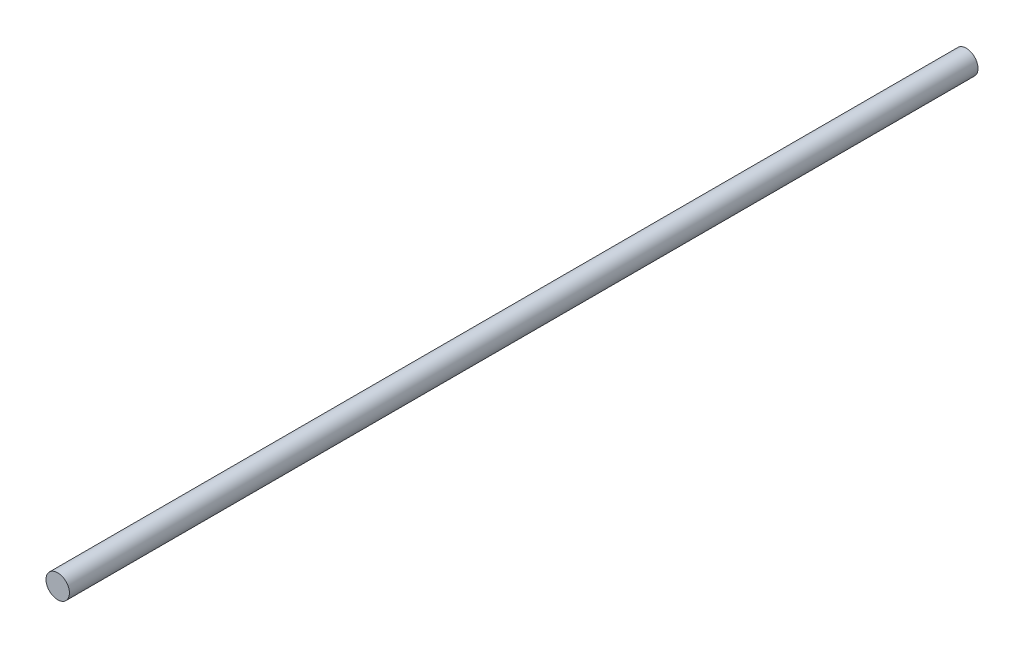
ISO-10303-21;
HEADER;
FILE_DESCRIPTION(('STEP AP214'),'2;1');
FILE_NAME('part.step','',(''),(''),'','','');
FILE_SCHEMA(('AUTOMOTIVE_DESIGN { 1 0 10303 214 1 1 1 1 }'));
ENDSEC;
DATA;
#1=APPLICATION_CONTEXT('core data for automotive mechanical design processes');
#2=APPLICATION_PROTOCOL_DEFINITION('international standard','automotive_design',2000,#1);
#3=PRODUCT_CONTEXT('',#1,'mechanical');
#4=PRODUCT('Part','Part','',(#3));
#5=PRODUCT_RELATED_PRODUCT_CATEGORY('part','',(#4));
#6=PRODUCT_DEFINITION_FORMATION('','',#4);
#7=PRODUCT_DEFINITION_CONTEXT('part definition',#1,'design');
#8=PRODUCT_DEFINITION('design','',#6,#7);
#9=PRODUCT_DEFINITION_SHAPE('','',#8);
#10=(LENGTH_UNIT() NAMED_UNIT(*) SI_UNIT(.MILLI.,.METRE.));
#11=(NAMED_UNIT(*) PLANE_ANGLE_UNIT() SI_UNIT($,.RADIAN.));
#12=(NAMED_UNIT(*) SI_UNIT($,.STERADIAN.) SOLID_ANGLE_UNIT());
#13=UNCERTAINTY_MEASURE_WITH_UNIT(LENGTH_MEASURE(1.E-05),#10,'distance_accuracy_value','');
#14=(GEOMETRIC_REPRESENTATION_CONTEXT(3) GLOBAL_UNCERTAINTY_ASSIGNED_CONTEXT((#13)) GLOBAL_UNIT_ASSIGNED_CONTEXT((#10,
#11,#12)) REPRESENTATION_CONTEXT('',''));
#15=CARTESIAN_POINT('',(0.,0.,0.));
#16=DIRECTION('',(0.,0.,1.));
#17=DIRECTION('',(1.,0.,0.));
#18=AXIS2_PLACEMENT_3D('',#15,#16,#17);
#19=CARTESIAN_POINT('',(0.,0.,310.));
#20=DIRECTION('',(0.,0.,-1.));
#21=DIRECTION('',(-1.,0.,0.));
#22=AXIS2_PLACEMENT_3D('',#19,#20,#21);
#23=CYLINDRICAL_SURFACE('',#22,4.);
#24=CARTESIAN_POINT('',(0.,0.,310.));
#25=DIRECTION('',(0.,0.,1.));
#26=DIRECTION('',(1.,0.,0.));
#27=AXIS2_PLACEMENT_3D('',#24,#25,#26);
#28=CIRCLE('',#27,4.);
#29=CARTESIAN_POINT('',(4.,0.,310.));
#30=VERTEX_POINT('',#29);
#31=EDGE_CURVE('E10',#30,#30,#28,.T.);
#32=ORIENTED_EDGE('',*,*,#31,.F.);
#33=EDGE_LOOP('',(#32));
#34=FACE_BOUND('',#33,.T.);
#35=CARTESIAN_POINT('',(0.,0.,0.));
#36=DIRECTION('',(0.,0.,1.));
#37=DIRECTION('',(1.,0.,0.));
#38=AXIS2_PLACEMENT_3D('',#35,#36,#37);
#39=CIRCLE('',#38,4.);
#40=CARTESIAN_POINT('',(4.,0.,0.));
#41=VERTEX_POINT('',#40);
#42=EDGE_CURVE('E40',#41,#41,#39,.T.);
#43=ORIENTED_EDGE('',*,*,#42,.T.);
#44=EDGE_LOOP('',(#43));
#45=FACE_BOUND('',#44,.T.);
#46=ADVANCED_FACE('F37',(#34,#45),#23,.T.);
#47=CARTESIAN_POINT('',(0.,0.,310.));
#48=DIRECTION('',(0.,0.,1.));
#49=DIRECTION('',(1.,0.,0.));
#50=AXIS2_PLACEMENT_3D('',#47,#48,#49);
#51=PLANE('',#50);
#52=ORIENTED_EDGE('',*,*,#31,.T.);
#53=EDGE_LOOP('',(#52));
#54=FACE_BOUND('',#53,.T.);
#55=ADVANCED_FACE('F54',(#54),#51,.T.);
#56=CARTESIAN_POINT('',(0.,0.,0.));
#57=DIRECTION('',(0.,0.,1.));
#58=DIRECTION('',(1.,0.,0.));
#59=AXIS2_PLACEMENT_3D('',#56,#57,#58);
#60=PLANE('',#59);
#61=ORIENTED_EDGE('',*,*,#42,.F.);
#62=EDGE_LOOP('',(#61));
#63=FACE_BOUND('',#62,.T.);
#64=ADVANCED_FACE('F52',(#63),#60,.F.);
#65=CLOSED_SHELL('',(#46,#55,#64));
#66=MANIFOLD_SOLID_BREP('B2',#65);
#67=ADVANCED_BREP_SHAPE_REPRESENTATION('',(#18,#66),#14);
#68=SHAPE_DEFINITION_REPRESENTATION(#9,#67);
ENDSEC;
END-ISO-10303-21;
